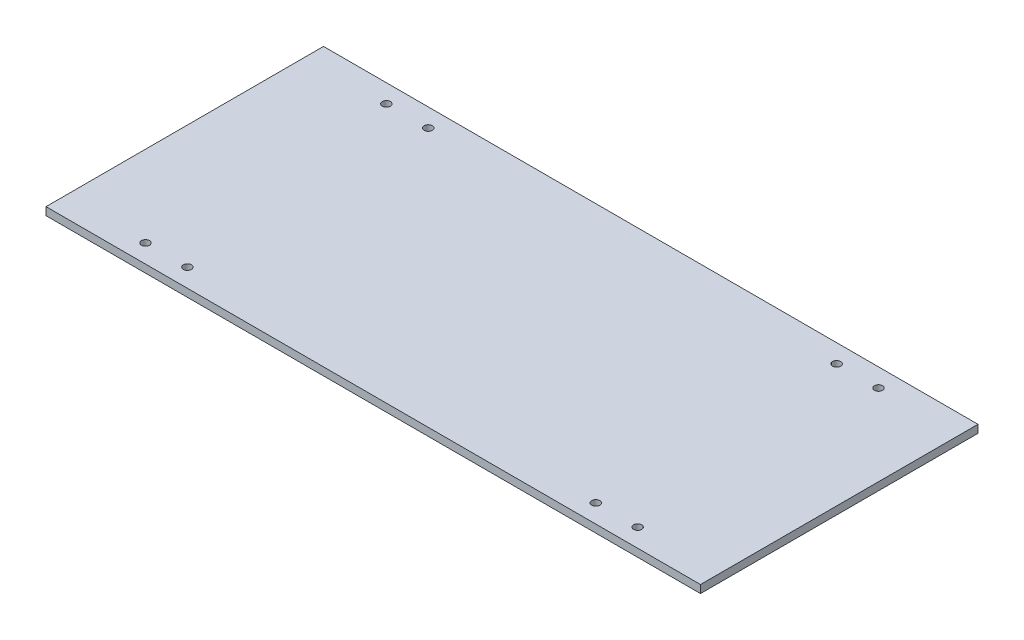
ISO-10303-21;
HEADER;
FILE_DESCRIPTION(('STEP AP214'),'2;1');
FILE_NAME('part.step','',(''),(''),'','','');
FILE_SCHEMA(('AUTOMOTIVE_DESIGN { 1 0 10303 214 1 1 1 1 }'));
ENDSEC;
DATA;
#1=APPLICATION_CONTEXT('core data for automotive mechanical design processes');
#2=APPLICATION_PROTOCOL_DEFINITION('international standard','automotive_design',2000,#1);
#3=PRODUCT_CONTEXT('',#1,'mechanical');
#4=PRODUCT('Part','Part','',(#3));
#5=PRODUCT_RELATED_PRODUCT_CATEGORY('part','',(#4));
#6=PRODUCT_DEFINITION_FORMATION('','',#4);
#7=PRODUCT_DEFINITION_CONTEXT('part definition',#1,'design');
#8=PRODUCT_DEFINITION('design','',#6,#7);
#9=PRODUCT_DEFINITION_SHAPE('','',#8);
#10=(LENGTH_UNIT() NAMED_UNIT(*) SI_UNIT(.MILLI.,.METRE.));
#11=(NAMED_UNIT(*) PLANE_ANGLE_UNIT() SI_UNIT($,.RADIAN.));
#12=(NAMED_UNIT(*) SI_UNIT($,.STERADIAN.) SOLID_ANGLE_UNIT());
#13=UNCERTAINTY_MEASURE_WITH_UNIT(LENGTH_MEASURE(1.E-05),#10,'distance_accuracy_value','');
#14=(GEOMETRIC_REPRESENTATION_CONTEXT(3) GLOBAL_UNCERTAINTY_ASSIGNED_CONTEXT((#13)) GLOBAL_UNIT_ASSIGNED_CONTEXT((#10,
#11,#12)) REPRESENTATION_CONTEXT('',''));
#15=CARTESIAN_POINT('',(0.,0.,0.));
#16=DIRECTION('',(0.,0.,1.));
#17=DIRECTION('',(1.,0.,0.));
#18=AXIS2_PLACEMENT_3D('',#15,#16,#17);
#19=CARTESIAN_POINT('',(0.,3.,0.));
#20=DIRECTION('',(0.,1.,0.));
#21=DIRECTION('',(0.,0.,1.));
#22=AXIS2_PLACEMENT_3D('',#19,#20,#21);
#23=PLANE('',#22);
#24=CARTESIAN_POINT('',(47.,3.,-7.00000000000003));
#25=DIRECTION('',(0.,1.,0.));
#26=DIRECTION('',(0.,0.,-1.));
#27=AXIS2_PLACEMENT_3D('',#24,#25,#26);
#28=CIRCLE('',#27,1.55);
#29=CARTESIAN_POINT('',(47.,3.,-8.55000000000003));
#30=VERTEX_POINT('',#29);
#31=EDGE_CURVE('E150',#30,#30,#28,.T.);
#32=ORIENTED_EDGE('',*,*,#31,.F.);
#33=EDGE_LOOP('',(#32));
#34=FACE_BOUND('',#33,.T.);
#35=CARTESIAN_POINT('',(219.,3.,-7.00000000000008));
#36=DIRECTION('',(0.,1.,0.));
#37=DIRECTION('',(0.,0.,1.));
#38=AXIS2_PLACEMENT_3D('',#35,#36,#37);
#39=CIRCLE('',#38,1.54999999999999);
#40=CARTESIAN_POINT('',(219.,3.,-5.45000000000008));
#41=VERTEX_POINT('',#40);
#42=EDGE_CURVE('E138',#41,#41,#39,.T.);
#43=ORIENTED_EDGE('',*,*,#42,.F.);
#44=EDGE_LOOP('',(#43));
#45=FACE_BOUND('',#44,.T.);
#46=CARTESIAN_POINT('',(203.,3.,-99.));
#47=DIRECTION('',(0.,1.,0.));
#48=DIRECTION('',(0.,0.,-1.));
#49=AXIS2_PLACEMENT_3D('',#46,#47,#48);
#50=CIRCLE('',#49,1.54999999999999);
#51=CARTESIAN_POINT('',(203.,3.,-100.55));
#52=VERTEX_POINT('',#51);
#53=EDGE_CURVE('E126',#52,#52,#50,.T.);
#54=ORIENTED_EDGE('',*,*,#53,.F.);
#55=EDGE_LOOP('',(#54));
#56=FACE_BOUND('',#55,.T.);
#57=CARTESIAN_POINT('',(31.,3.,-99.));
#58=DIRECTION('',(0.,1.,0.));
#59=DIRECTION('',(0.,0.,1.));
#60=AXIS2_PLACEMENT_3D('',#57,#58,#59);
#61=CIRCLE('',#60,1.55);
#62=CARTESIAN_POINT('',(31.,3.,-97.45));
#63=VERTEX_POINT('',#62);
#64=EDGE_CURVE('E105',#63,#63,#61,.T.);
#65=ORIENTED_EDGE('',*,*,#64,.F.);
#66=EDGE_LOOP('',(#65));
#67=FACE_BOUND('',#66,.T.);
#68=DIRECTION('',(0.,0.,1.));
#69=VECTOR('',#68,1.);
#70=CARTESIAN_POINT('',(0.,3.,-106.));
#71=LINE('',#70,#69);
#72=CARTESIAN_POINT('',(0.,3.,-106.));
#73=VERTEX_POINT('',#72);
#74=CARTESIAN_POINT('',(0.,3.,0.));
#75=VERTEX_POINT('',#74);
#76=EDGE_CURVE('E90',#73,#75,#71,.T.);
#77=ORIENTED_EDGE('',*,*,#76,.T.);
#78=DIRECTION('',(1.,0.,0.));
#79=VECTOR('',#78,1.);
#80=CARTESIAN_POINT('',(0.,3.,0.));
#81=LINE('',#80,#79);
#82=CARTESIAN_POINT('',(250.,3.,0.));
#83=VERTEX_POINT('',#82);
#84=EDGE_CURVE('E85',#75,#83,#81,.T.);
#85=ORIENTED_EDGE('',*,*,#84,.T.);
#86=DIRECTION('',(0.,0.,-1.));
#87=VECTOR('',#86,1.);
#88=CARTESIAN_POINT('',(250.,3.,-106.));
#89=LINE('',#88,#87);
#90=CARTESIAN_POINT('',(250.,3.,-106.));
#91=VERTEX_POINT('',#90);
#92=EDGE_CURVE('E88',#83,#91,#89,.T.);
#93=ORIENTED_EDGE('',*,*,#92,.T.);
#94=DIRECTION('',(-1.,0.,0.));
#95=VECTOR('',#94,1.);
#96=CARTESIAN_POINT('',(0.,3.,-106.));
#97=LINE('',#96,#95);
#98=EDGE_CURVE('E55',#91,#73,#97,.T.);
#99=ORIENTED_EDGE('',*,*,#98,.T.);
#100=EDGE_LOOP('',(#77,#85,#93,#99));
#101=FACE_BOUND('',#100,.T.);
#102=CARTESIAN_POINT('',(47.,3.,-99.));
#103=DIRECTION('',(0.,1.,0.));
#104=DIRECTION('',(0.,0.,1.));
#105=AXIS2_PLACEMENT_3D('',#102,#103,#104);
#106=CIRCLE('',#105,1.55);
#107=CARTESIAN_POINT('',(47.,3.,-97.45));
#108=VERTEX_POINT('',#107);
#109=EDGE_CURVE('E120',#108,#108,#106,.T.);
#110=ORIENTED_EDGE('',*,*,#109,.F.);
#111=EDGE_LOOP('',(#110));
#112=FACE_BOUND('',#111,.T.);
#113=CARTESIAN_POINT('',(219.,3.,-99.0000000000001));
#114=DIRECTION('',(0.,1.,0.));
#115=DIRECTION('',(0.,0.,-1.));
#116=AXIS2_PLACEMENT_3D('',#113,#114,#115);
#117=CIRCLE('',#116,1.54999999999999);
#118=CARTESIAN_POINT('',(219.,3.,-100.55));
#119=VERTEX_POINT('',#118);
#120=EDGE_CURVE('E132',#119,#119,#117,.T.);
#121=ORIENTED_EDGE('',*,*,#120,.F.);
#122=EDGE_LOOP('',(#121));
#123=FACE_BOUND('',#122,.T.);
#124=CARTESIAN_POINT('',(203.,3.,-7.00000000000008));
#125=DIRECTION('',(0.,1.,0.));
#126=DIRECTION('',(0.,0.,1.));
#127=AXIS2_PLACEMENT_3D('',#124,#125,#126);
#128=CIRCLE('',#127,1.54999999999999);
#129=CARTESIAN_POINT('',(203.,3.,-5.45000000000008));
#130=VERTEX_POINT('',#129);
#131=EDGE_CURVE('E144',#130,#130,#128,.T.);
#132=ORIENTED_EDGE('',*,*,#131,.F.);
#133=EDGE_LOOP('',(#132));
#134=FACE_BOUND('',#133,.T.);
#135=CARTESIAN_POINT('',(31.,3.,-7.00000000000002));
#136=DIRECTION('',(0.,1.,0.));
#137=DIRECTION('',(0.,0.,-1.));
#138=AXIS2_PLACEMENT_3D('',#135,#136,#137);
#139=CIRCLE('',#138,1.55);
#140=CARTESIAN_POINT('',(31.,3.,-8.55000000000002));
#141=VERTEX_POINT('',#140);
#142=EDGE_CURVE('E156',#141,#141,#139,.T.);
#143=ORIENTED_EDGE('',*,*,#142,.F.);
#144=EDGE_LOOP('',(#143));
#145=FACE_BOUND('',#144,.T.);
#146=ADVANCED_FACE('F38',(#34,#45,#56,#67,#101,#112,#123,#134,#145),#23,.T.);
#147=CARTESIAN_POINT('',(0.,0.,0.));
#148=DIRECTION('',(0.,1.,0.));
#149=DIRECTION('',(0.,0.,1.));
#150=AXIS2_PLACEMENT_3D('',#147,#148,#149);
#151=PLANE('',#150);
#152=DIRECTION('',(0.,0.,1.));
#153=VECTOR('',#152,1.);
#154=CARTESIAN_POINT('',(0.,0.,-106.));
#155=LINE('',#154,#153);
#156=CARTESIAN_POINT('',(0.,0.,-106.));
#157=VERTEX_POINT('',#156);
#158=CARTESIAN_POINT('',(0.,0.,0.));
#159=VERTEX_POINT('',#158);
#160=EDGE_CURVE('E102',#157,#159,#155,.T.);
#161=ORIENTED_EDGE('',*,*,#160,.F.);
#162=DIRECTION('',(-1.,0.,0.));
#163=VECTOR('',#162,1.);
#164=CARTESIAN_POINT('',(0.,0.,-106.));
#165=LINE('',#164,#163);
#166=CARTESIAN_POINT('',(250.,0.,-106.));
#167=VERTEX_POINT('',#166);
#168=EDGE_CURVE('E78',#167,#157,#165,.T.);
#169=ORIENTED_EDGE('',*,*,#168,.F.);
#170=DIRECTION('',(0.,0.,-1.));
#171=VECTOR('',#170,1.);
#172=CARTESIAN_POINT('',(250.,0.,-106.));
#173=LINE('',#172,#171);
#174=CARTESIAN_POINT('',(250.,0.,0.));
#175=VERTEX_POINT('',#174);
#176=EDGE_CURVE('E72',#175,#167,#173,.T.);
#177=ORIENTED_EDGE('',*,*,#176,.F.);
#178=DIRECTION('',(1.,0.,0.));
#179=VECTOR('',#178,1.);
#180=CARTESIAN_POINT('',(0.,0.,0.));
#181=LINE('',#180,#179);
#182=EDGE_CURVE('E94',#159,#175,#181,.T.);
#183=ORIENTED_EDGE('',*,*,#182,.F.);
#184=EDGE_LOOP('',(#161,#169,#177,#183));
#185=FACE_BOUND('',#184,.T.);
#186=CARTESIAN_POINT('',(31.,0.,-99.));
#187=DIRECTION('',(0.,1.,0.));
#188=DIRECTION('',(0.,0.,1.));
#189=AXIS2_PLACEMENT_3D('',#186,#187,#188);
#190=CIRCLE('',#189,1.55);
#191=CARTESIAN_POINT('',(31.,0.,-97.45));
#192=VERTEX_POINT('',#191);
#193=EDGE_CURVE('E117',#192,#192,#190,.T.);
#194=ORIENTED_EDGE('',*,*,#193,.T.);
#195=EDGE_LOOP('',(#194));
#196=FACE_BOUND('',#195,.T.);
#197=CARTESIAN_POINT('',(47.,0.,-99.));
#198=DIRECTION('',(0.,1.,0.));
#199=DIRECTION('',(0.,0.,1.));
#200=AXIS2_PLACEMENT_3D('',#197,#198,#199);
#201=CIRCLE('',#200,1.55);
#202=CARTESIAN_POINT('',(47.,0.,-97.45));
#203=VERTEX_POINT('',#202);
#204=EDGE_CURVE('E123',#203,#203,#201,.T.);
#205=ORIENTED_EDGE('',*,*,#204,.T.);
#206=EDGE_LOOP('',(#205));
#207=FACE_BOUND('',#206,.T.);
#208=CARTESIAN_POINT('',(203.,0.,-99.));
#209=DIRECTION('',(0.,1.,0.));
#210=DIRECTION('',(0.,0.,-1.));
#211=AXIS2_PLACEMENT_3D('',#208,#209,#210);
#212=CIRCLE('',#211,1.54999999999999);
#213=CARTESIAN_POINT('',(203.,0.,-100.55));
#214=VERTEX_POINT('',#213);
#215=EDGE_CURVE('E129',#214,#214,#212,.T.);
#216=ORIENTED_EDGE('',*,*,#215,.T.);
#217=EDGE_LOOP('',(#216));
#218=FACE_BOUND('',#217,.T.);
#219=CARTESIAN_POINT('',(219.,0.,-99.0000000000001));
#220=DIRECTION('',(0.,1.,0.));
#221=DIRECTION('',(0.,0.,-1.));
#222=AXIS2_PLACEMENT_3D('',#219,#220,#221);
#223=CIRCLE('',#222,1.54999999999999);
#224=CARTESIAN_POINT('',(219.,0.,-100.55));
#225=VERTEX_POINT('',#224);
#226=EDGE_CURVE('E135',#225,#225,#223,.T.);
#227=ORIENTED_EDGE('',*,*,#226,.T.);
#228=EDGE_LOOP('',(#227));
#229=FACE_BOUND('',#228,.T.);
#230=CARTESIAN_POINT('',(219.,0.,-7.00000000000008));
#231=DIRECTION('',(0.,1.,0.));
#232=DIRECTION('',(0.,0.,1.));
#233=AXIS2_PLACEMENT_3D('',#230,#231,#232);
#234=CIRCLE('',#233,1.54999999999999);
#235=CARTESIAN_POINT('',(219.,0.,-5.45000000000008));
#236=VERTEX_POINT('',#235);
#237=EDGE_CURVE('E141',#236,#236,#234,.T.);
#238=ORIENTED_EDGE('',*,*,#237,.T.);
#239=EDGE_LOOP('',(#238));
#240=FACE_BOUND('',#239,.T.);
#241=CARTESIAN_POINT('',(203.,0.,-7.00000000000008));
#242=DIRECTION('',(0.,1.,0.));
#243=DIRECTION('',(0.,0.,1.));
#244=AXIS2_PLACEMENT_3D('',#241,#242,#243);
#245=CIRCLE('',#244,1.54999999999999);
#246=CARTESIAN_POINT('',(203.,0.,-5.45000000000008));
#247=VERTEX_POINT('',#246);
#248=EDGE_CURVE('E147',#247,#247,#245,.T.);
#249=ORIENTED_EDGE('',*,*,#248,.T.);
#250=EDGE_LOOP('',(#249));
#251=FACE_BOUND('',#250,.T.);
#252=CARTESIAN_POINT('',(47.,0.,-7.00000000000003));
#253=DIRECTION('',(0.,1.,0.));
#254=DIRECTION('',(0.,0.,-1.));
#255=AXIS2_PLACEMENT_3D('',#252,#253,#254);
#256=CIRCLE('',#255,1.55);
#257=CARTESIAN_POINT('',(47.,0.,-8.55000000000003));
#258=VERTEX_POINT('',#257);
#259=EDGE_CURVE('E153',#258,#258,#256,.T.);
#260=ORIENTED_EDGE('',*,*,#259,.T.);
#261=EDGE_LOOP('',(#260));
#262=FACE_BOUND('',#261,.T.);
#263=CARTESIAN_POINT('',(31.,0.,-7.00000000000002));
#264=DIRECTION('',(0.,1.,0.));
#265=DIRECTION('',(0.,0.,-1.));
#266=AXIS2_PLACEMENT_3D('',#263,#264,#265);
#267=CIRCLE('',#266,1.55);
#268=CARTESIAN_POINT('',(31.,0.,-8.55000000000002));
#269=VERTEX_POINT('',#268);
#270=EDGE_CURVE('E159',#269,#269,#267,.T.);
#271=ORIENTED_EDGE('',*,*,#270,.T.);
#272=EDGE_LOOP('',(#271));
#273=FACE_BOUND('',#272,.T.);
#274=ADVANCED_FACE('F113',(#185,#196,#207,#218,#229,#240,#251,#262,#273),#151,.F.);
#275=CARTESIAN_POINT('',(0.,3.,-106.));
#276=DIRECTION('',(1.,0.,0.));
#277=DIRECTION('',(0.,0.,-1.));
#278=AXIS2_PLACEMENT_3D('',#275,#276,#277);
#279=PLANE('',#278);
#280=ORIENTED_EDGE('',*,*,#160,.T.);
#281=DIRECTION('',(0.,-1.,0.));
#282=VECTOR('',#281,1.);
#283=CARTESIAN_POINT('',(0.,3.,0.));
#284=LINE('',#283,#282);
#285=EDGE_CURVE('E11',#75,#159,#284,.T.);
#286=ORIENTED_EDGE('',*,*,#285,.F.);
#287=ORIENTED_EDGE('',*,*,#76,.F.);
#288=DIRECTION('',(0.,-1.,0.));
#289=VECTOR('',#288,1.);
#290=CARTESIAN_POINT('',(0.,3.,-106.));
#291=LINE('',#290,#289);
#292=EDGE_CURVE('E98',#73,#157,#291,.T.);
#293=ORIENTED_EDGE('',*,*,#292,.T.);
#294=EDGE_LOOP('',(#280,#286,#287,#293));
#295=FACE_BOUND('',#294,.T.);
#296=ADVANCED_FACE('F40',(#295),#279,.F.);
#297=CARTESIAN_POINT('',(0.,3.,0.));
#298=DIRECTION('',(0.,0.,-1.));
#299=DIRECTION('',(-1.,0.,0.));
#300=AXIS2_PLACEMENT_3D('',#297,#298,#299);
#301=PLANE('',#300);
#302=ORIENTED_EDGE('',*,*,#182,.T.);
#303=DIRECTION('',(0.,-1.,0.));
#304=VECTOR('',#303,1.);
#305=CARTESIAN_POINT('',(250.,3.,0.));
#306=LINE('',#305,#304);
#307=EDGE_CURVE('E47',#83,#175,#306,.T.);
#308=ORIENTED_EDGE('',*,*,#307,.F.);
#309=ORIENTED_EDGE('',*,*,#84,.F.);
#310=ORIENTED_EDGE('',*,*,#285,.T.);
#311=EDGE_LOOP('',(#302,#308,#309,#310));
#312=FACE_BOUND('',#311,.T.);
#313=ADVANCED_FACE('F93',(#312),#301,.F.);
#314=CARTESIAN_POINT('',(250.,3.,-106.));
#315=DIRECTION('',(-1.,0.,0.));
#316=DIRECTION('',(0.,0.,1.));
#317=AXIS2_PLACEMENT_3D('',#314,#315,#316);
#318=PLANE('',#317);
#319=ORIENTED_EDGE('',*,*,#176,.T.);
#320=DIRECTION('',(0.,-1.,0.));
#321=VECTOR('',#320,1.);
#322=CARTESIAN_POINT('',(250.,3.,-106.));
#323=LINE('',#322,#321);
#324=EDGE_CURVE('E95',#91,#167,#323,.T.);
#325=ORIENTED_EDGE('',*,*,#324,.F.);
#326=ORIENTED_EDGE('',*,*,#92,.F.);
#327=ORIENTED_EDGE('',*,*,#307,.T.);
#328=EDGE_LOOP('',(#319,#325,#326,#327));
#329=FACE_BOUND('',#328,.T.);
#330=ADVANCED_FACE('F96',(#329),#318,.F.);
#331=CARTESIAN_POINT('',(0.,3.,-106.));
#332=DIRECTION('',(0.,0.,1.));
#333=DIRECTION('',(1.,0.,0.));
#334=AXIS2_PLACEMENT_3D('',#331,#332,#333);
#335=PLANE('',#334);
#336=ORIENTED_EDGE('',*,*,#168,.T.);
#337=ORIENTED_EDGE('',*,*,#292,.F.);
#338=ORIENTED_EDGE('',*,*,#98,.F.);
#339=ORIENTED_EDGE('',*,*,#324,.T.);
#340=EDGE_LOOP('',(#336,#337,#338,#339));
#341=FACE_BOUND('',#340,.T.);
#342=ADVANCED_FACE('F110',(#341),#335,.F.);
#343=CARTESIAN_POINT('',(31.,3.,-99.));
#344=DIRECTION('',(0.,-1.,0.));
#345=DIRECTION('',(0.,0.,-1.));
#346=AXIS2_PLACEMENT_3D('',#343,#344,#345);
#347=CYLINDRICAL_SURFACE('',#346,1.55);
#348=ORIENTED_EDGE('',*,*,#64,.T.);
#349=EDGE_LOOP('',(#348));
#350=FACE_BOUND('',#349,.T.);
#351=ORIENTED_EDGE('',*,*,#193,.F.);
#352=EDGE_LOOP('',(#351));
#353=FACE_BOUND('',#352,.T.);
#354=ADVANCED_FACE('F178',(#350,#353),#347,.F.);
#355=CARTESIAN_POINT('',(47.,3.,-99.));
#356=DIRECTION('',(0.,-1.,0.));
#357=DIRECTION('',(0.,0.,-1.));
#358=AXIS2_PLACEMENT_3D('',#355,#356,#357);
#359=CYLINDRICAL_SURFACE('',#358,1.55);
#360=ORIENTED_EDGE('',*,*,#109,.T.);
#361=EDGE_LOOP('',(#360));
#362=FACE_BOUND('',#361,.T.);
#363=ORIENTED_EDGE('',*,*,#204,.F.);
#364=EDGE_LOOP('',(#363));
#365=FACE_BOUND('',#364,.T.);
#366=ADVANCED_FACE('F223',(#362,#365),#359,.F.);
#367=CARTESIAN_POINT('',(203.,3.,-99.));
#368=DIRECTION('',(0.,-1.,0.));
#369=DIRECTION('',(0.,0.,-1.));
#370=AXIS2_PLACEMENT_3D('',#367,#368,#369);
#371=CYLINDRICAL_SURFACE('',#370,1.54999999999999);
#372=ORIENTED_EDGE('',*,*,#53,.T.);
#373=EDGE_LOOP('',(#372));
#374=FACE_BOUND('',#373,.T.);
#375=ORIENTED_EDGE('',*,*,#215,.F.);
#376=EDGE_LOOP('',(#375));
#377=FACE_BOUND('',#376,.T.);
#378=ADVANCED_FACE('F231',(#374,#377),#371,.F.);
#379=CARTESIAN_POINT('',(219.,3.,-99.0000000000001));
#380=DIRECTION('',(0.,-1.,0.));
#381=DIRECTION('',(0.,0.,-1.));
#382=AXIS2_PLACEMENT_3D('',#379,#380,#381);
#383=CYLINDRICAL_SURFACE('',#382,1.54999999999999);
#384=ORIENTED_EDGE('',*,*,#120,.T.);
#385=EDGE_LOOP('',(#384));
#386=FACE_BOUND('',#385,.T.);
#387=ORIENTED_EDGE('',*,*,#226,.F.);
#388=EDGE_LOOP('',(#387));
#389=FACE_BOUND('',#388,.T.);
#390=ADVANCED_FACE('F239',(#386,#389),#383,.F.);
#391=CARTESIAN_POINT('',(219.,3.,-7.00000000000008));
#392=DIRECTION('',(0.,-1.,0.));
#393=DIRECTION('',(0.,0.,-1.));
#394=AXIS2_PLACEMENT_3D('',#391,#392,#393);
#395=CYLINDRICAL_SURFACE('',#394,1.54999999999999);
#396=ORIENTED_EDGE('',*,*,#42,.T.);
#397=EDGE_LOOP('',(#396));
#398=FACE_BOUND('',#397,.T.);
#399=ORIENTED_EDGE('',*,*,#237,.F.);
#400=EDGE_LOOP('',(#399));
#401=FACE_BOUND('',#400,.T.);
#402=ADVANCED_FACE('F248',(#398,#401),#395,.F.);
#403=CARTESIAN_POINT('',(203.,3.,-7.00000000000008));
#404=DIRECTION('',(0.,-1.,0.));
#405=DIRECTION('',(0.,0.,-1.));
#406=AXIS2_PLACEMENT_3D('',#403,#404,#405);
#407=CYLINDRICAL_SURFACE('',#406,1.54999999999999);
#408=ORIENTED_EDGE('',*,*,#131,.T.);
#409=EDGE_LOOP('',(#408));
#410=FACE_BOUND('',#409,.T.);
#411=ORIENTED_EDGE('',*,*,#248,.F.);
#412=EDGE_LOOP('',(#411));
#413=FACE_BOUND('',#412,.T.);
#414=ADVANCED_FACE('F257',(#410,#413),#407,.F.);
#415=CARTESIAN_POINT('',(47.,3.,-7.00000000000003));
#416=DIRECTION('',(0.,-1.,0.));
#417=DIRECTION('',(0.,0.,-1.));
#418=AXIS2_PLACEMENT_3D('',#415,#416,#417);
#419=CYLINDRICAL_SURFACE('',#418,1.55);
#420=ORIENTED_EDGE('',*,*,#31,.T.);
#421=EDGE_LOOP('',(#420));
#422=FACE_BOUND('',#421,.T.);
#423=ORIENTED_EDGE('',*,*,#259,.F.);
#424=EDGE_LOOP('',(#423));
#425=FACE_BOUND('',#424,.T.);
#426=ADVANCED_FACE('F266',(#422,#425),#419,.F.);
#427=CARTESIAN_POINT('',(31.,3.,-7.00000000000002));
#428=DIRECTION('',(0.,-1.,0.));
#429=DIRECTION('',(0.,0.,-1.));
#430=AXIS2_PLACEMENT_3D('',#427,#428,#429);
#431=CYLINDRICAL_SURFACE('',#430,1.55);
#432=ORIENTED_EDGE('',*,*,#142,.T.);
#433=EDGE_LOOP('',(#432));
#434=FACE_BOUND('',#433,.T.);
#435=ORIENTED_EDGE('',*,*,#270,.F.);
#436=EDGE_LOOP('',(#435));
#437=FACE_BOUND('',#436,.T.);
#438=ADVANCED_FACE('F165',(#434,#437),#431,.F.);
#439=CLOSED_SHELL('',(#146,#274,#296,#313,#330,#342,#354,#366,#378,#390,#402,#414,#426,#438));
#440=MANIFOLD_SOLID_BREP('B2',#439);
#441=ADVANCED_BREP_SHAPE_REPRESENTATION('',(#18,#440),#14);
#442=SHAPE_DEFINITION_REPRESENTATION(#9,#441);
ENDSEC;
END-ISO-10303-21;
